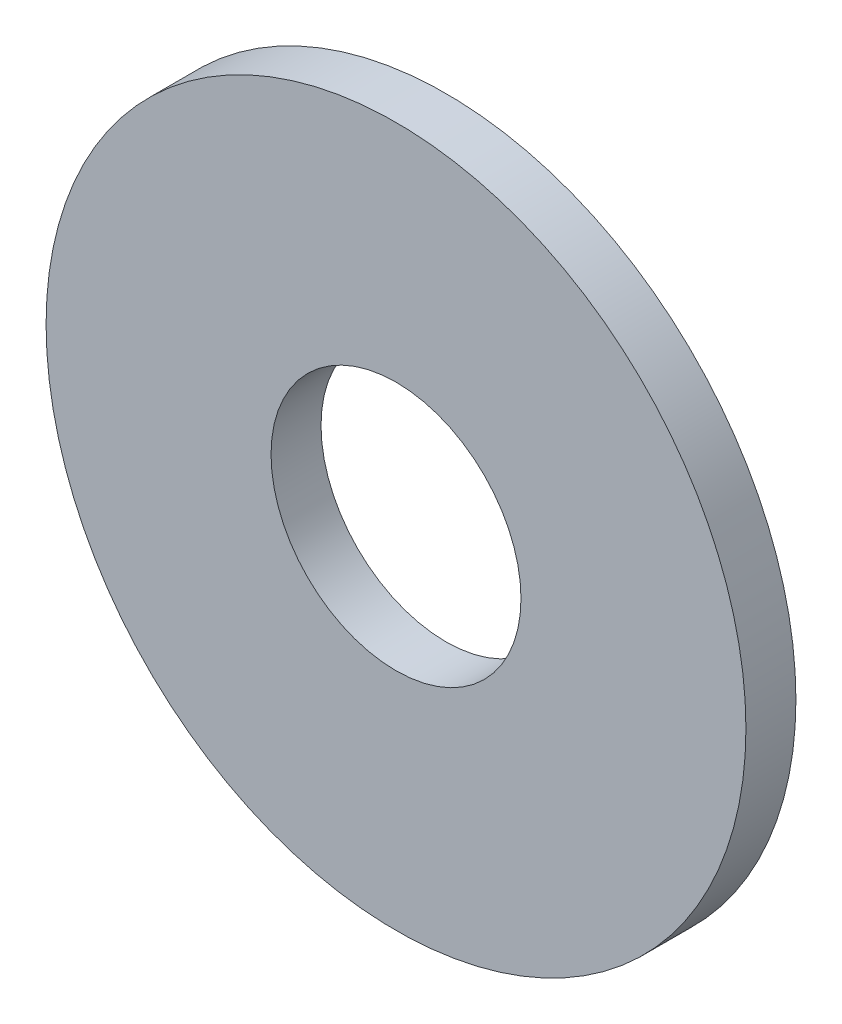
ISO-10303-21;
HEADER;
FILE_DESCRIPTION(('STEP AP214'),'2;1');
FILE_NAME('part.step','',(''),(''),'','','');
FILE_SCHEMA(('AUTOMOTIVE_DESIGN { 1 0 10303 214 1 1 1 1 }'));
ENDSEC;
DATA;
#1=APPLICATION_CONTEXT('core data for automotive mechanical design processes');
#2=APPLICATION_PROTOCOL_DEFINITION('international standard','automotive_design',2000,#1);
#3=PRODUCT_CONTEXT('',#1,'mechanical');
#4=PRODUCT('Part','Part','',(#3));
#5=PRODUCT_RELATED_PRODUCT_CATEGORY('part','',(#4));
#6=PRODUCT_DEFINITION_FORMATION('','',#4);
#7=PRODUCT_DEFINITION_CONTEXT('part definition',#1,'design');
#8=PRODUCT_DEFINITION('design','',#6,#7);
#9=PRODUCT_DEFINITION_SHAPE('','',#8);
#10=(LENGTH_UNIT() NAMED_UNIT(*) SI_UNIT(.MILLI.,.METRE.));
#11=(NAMED_UNIT(*) PLANE_ANGLE_UNIT() SI_UNIT($,.RADIAN.));
#12=(NAMED_UNIT(*) SI_UNIT($,.STERADIAN.) SOLID_ANGLE_UNIT());
#13=UNCERTAINTY_MEASURE_WITH_UNIT(LENGTH_MEASURE(1.E-05),#10,'distance_accuracy_value','');
#14=(GEOMETRIC_REPRESENTATION_CONTEXT(3) GLOBAL_UNCERTAINTY_ASSIGNED_CONTEXT((#13)) GLOBAL_UNIT_ASSIGNED_CONTEXT((#10,
#11,#12)) REPRESENTATION_CONTEXT('',''));
#15=CARTESIAN_POINT('',(0.,0.,0.));
#16=DIRECTION('',(0.,0.,1.));
#17=DIRECTION('',(1.,0.,0.));
#18=AXIS2_PLACEMENT_3D('',#15,#16,#17);
#19=CARTESIAN_POINT('',(0.,0.,1.));
#20=DIRECTION('',(0.,0.,1.));
#21=DIRECTION('',(1.,0.,0.));
#22=AXIS2_PLACEMENT_3D('',#19,#20,#21);
#23=PLANE('',#22);
#24=CARTESIAN_POINT('',(0.,0.,1.));
#25=DIRECTION('',(0.,0.,1.));
#26=DIRECTION('',(1.,0.,0.));
#27=AXIS2_PLACEMENT_3D('',#24,#25,#26);
#28=CIRCLE('',#27,7.);
#29=CARTESIAN_POINT('',(7.,0.,1.));
#30=VERTEX_POINT('',#29);
#31=EDGE_CURVE('E10',#30,#30,#28,.T.);
#32=ORIENTED_EDGE('',*,*,#31,.T.);
#33=EDGE_LOOP('',(#32));
#34=FACE_BOUND('',#33,.T.);
#35=CARTESIAN_POINT('',(0.,0.,1.));
#36=DIRECTION('',(0.,0.,1.));
#37=DIRECTION('',(1.,0.,0.));
#38=AXIS2_PLACEMENT_3D('',#35,#36,#37);
#39=CIRCLE('',#38,2.5);
#40=CARTESIAN_POINT('',(2.5,0.,1.));
#41=VERTEX_POINT('',#40);
#42=EDGE_CURVE('E40',#41,#41,#39,.T.);
#43=ORIENTED_EDGE('',*,*,#42,.F.);
#44=EDGE_LOOP('',(#43));
#45=FACE_BOUND('',#44,.T.);
#46=ADVANCED_FACE('F29',(#34,#45),#23,.T.);
#47=CARTESIAN_POINT('',(0.,0.,0.));
#48=DIRECTION('',(0.,0.,1.));
#49=DIRECTION('',(1.,0.,0.));
#50=AXIS2_PLACEMENT_3D('',#47,#48,#49);
#51=PLANE('',#50);
#52=CARTESIAN_POINT('',(0.,0.,0.));
#53=DIRECTION('',(0.,0.,1.));
#54=DIRECTION('',(1.,0.,0.));
#55=AXIS2_PLACEMENT_3D('',#52,#53,#54);
#56=CIRCLE('',#55,7.);
#57=CARTESIAN_POINT('',(7.,0.,0.));
#58=VERTEX_POINT('',#57);
#59=EDGE_CURVE('E33',#58,#58,#56,.T.);
#60=ORIENTED_EDGE('',*,*,#59,.F.);
#61=EDGE_LOOP('',(#60));
#62=FACE_BOUND('',#61,.T.);
#63=CARTESIAN_POINT('',(0.,0.,0.));
#64=DIRECTION('',(0.,0.,1.));
#65=DIRECTION('',(1.,0.,0.));
#66=AXIS2_PLACEMENT_3D('',#63,#64,#65);
#67=CIRCLE('',#66,2.5);
#68=CARTESIAN_POINT('',(2.5,0.,0.));
#69=VERTEX_POINT('',#68);
#70=EDGE_CURVE('E42',#69,#69,#67,.T.);
#71=ORIENTED_EDGE('',*,*,#70,.T.);
#72=EDGE_LOOP('',(#71));
#73=FACE_BOUND('',#72,.T.);
#74=ADVANCED_FACE('F52',(#62,#73),#51,.F.);
#75=CARTESIAN_POINT('',(0.,0.,1.));
#76=DIRECTION('',(0.,0.,-1.));
#77=DIRECTION('',(-1.,0.,0.));
#78=AXIS2_PLACEMENT_3D('',#75,#76,#77);
#79=CYLINDRICAL_SURFACE('',#78,7.);
#80=ORIENTED_EDGE('',*,*,#31,.F.);
#81=EDGE_LOOP('',(#80));
#82=FACE_BOUND('',#81,.T.);
#83=ORIENTED_EDGE('',*,*,#59,.T.);
#84=EDGE_LOOP('',(#83));
#85=FACE_BOUND('',#84,.T.);
#86=ADVANCED_FACE('F31',(#82,#85),#79,.T.);
#87=CARTESIAN_POINT('',(0.,0.,1.));
#88=DIRECTION('',(0.,0.,-1.));
#89=DIRECTION('',(-1.,0.,0.));
#90=AXIS2_PLACEMENT_3D('',#87,#88,#89);
#91=CYLINDRICAL_SURFACE('',#90,2.5);
#92=ORIENTED_EDGE('',*,*,#42,.T.);
#93=EDGE_LOOP('',(#92));
#94=FACE_BOUND('',#93,.T.);
#95=ORIENTED_EDGE('',*,*,#70,.F.);
#96=EDGE_LOOP('',(#95));
#97=FACE_BOUND('',#96,.T.);
#98=ADVANCED_FACE('F48',(#94,#97),#91,.F.);
#99=CLOSED_SHELL('',(#46,#74,#86,#98));
#100=MANIFOLD_SOLID_BREP('B2',#99);
#101=ADVANCED_BREP_SHAPE_REPRESENTATION('',(#18,#100),#14);
#102=SHAPE_DEFINITION_REPRESENTATION(#9,#101);
ENDSEC;
END-ISO-10303-21;
